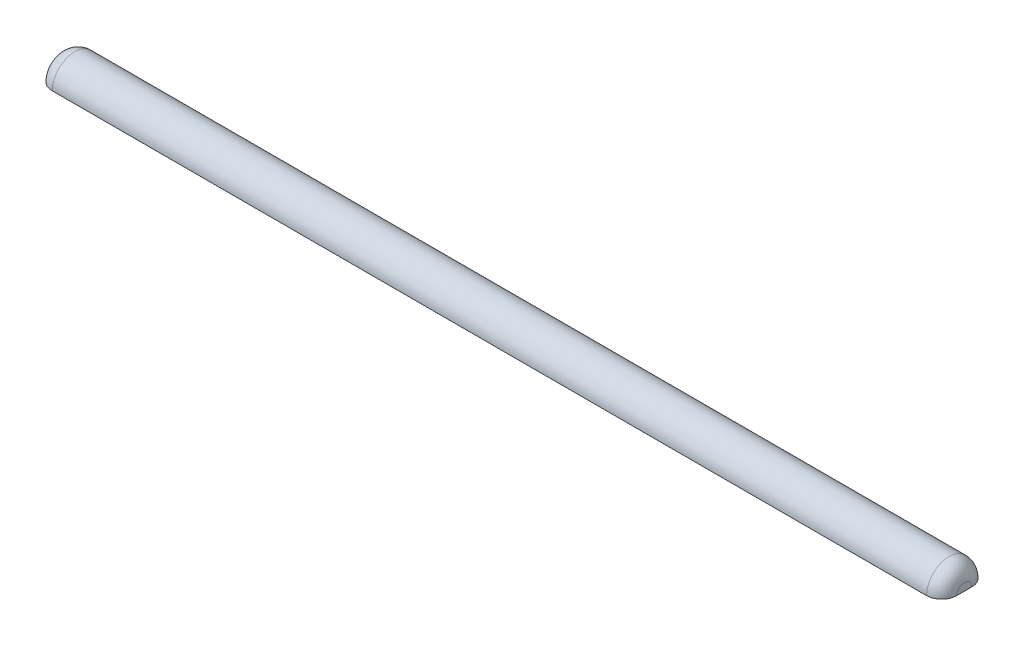
ISO-10303-21;
HEADER;
FILE_DESCRIPTION(('STEP AP214'),'2;1');
FILE_NAME('part.step','',(''),(''),'','','');
FILE_SCHEMA(('AUTOMOTIVE_DESIGN { 1 0 10303 214 1 1 1 1 }'));
ENDSEC;
DATA;
#1=APPLICATION_CONTEXT('core data for automotive mechanical design processes');
#2=APPLICATION_PROTOCOL_DEFINITION('international standard','automotive_design',2000,#1);
#3=PRODUCT_CONTEXT('',#1,'mechanical');
#4=PRODUCT('Part','Part','',(#3));
#5=PRODUCT_RELATED_PRODUCT_CATEGORY('part','',(#4));
#6=PRODUCT_DEFINITION_FORMATION('','',#4);
#7=PRODUCT_DEFINITION_CONTEXT('part definition',#1,'design');
#8=PRODUCT_DEFINITION('design','',#6,#7);
#9=PRODUCT_DEFINITION_SHAPE('','',#8);
#10=(LENGTH_UNIT() NAMED_UNIT(*) SI_UNIT(.MILLI.,.METRE.));
#11=(NAMED_UNIT(*) PLANE_ANGLE_UNIT() SI_UNIT($,.RADIAN.));
#12=(NAMED_UNIT(*) SI_UNIT($,.STERADIAN.) SOLID_ANGLE_UNIT());
#13=UNCERTAINTY_MEASURE_WITH_UNIT(LENGTH_MEASURE(1.E-05),#10,'distance_accuracy_value','');
#14=(GEOMETRIC_REPRESENTATION_CONTEXT(3) GLOBAL_UNCERTAINTY_ASSIGNED_CONTEXT((#13)) GLOBAL_UNIT_ASSIGNED_CONTEXT((#10,
#11,#12)) REPRESENTATION_CONTEXT('',''));
#15=CARTESIAN_POINT('',(0.,0.,0.));
#16=DIRECTION('',(0.,0.,1.));
#17=DIRECTION('',(1.,0.,0.));
#18=AXIS2_PLACEMENT_3D('',#15,#16,#17);
#19=CARTESIAN_POINT('',(3.,0.,-0.075));
#20=DIRECTION('',(-1.,0.,0.));
#21=DIRECTION('',(0.,0.,1.));
#22=AXIS2_PLACEMENT_3D('',#19,#20,#21);
#23=CYLINDRICAL_SURFACE('',#22,0.075);
#24=DIRECTION('',(-1.,0.,0.));
#25=VECTOR('',#24,1.);
#26=CARTESIAN_POINT('',(3.,0.,0.));
#27=LINE('',#26,#25);
#28=CARTESIAN_POINT('',(2.95,0.,0.));
#29=VERTEX_POINT('',#28);
#30=CARTESIAN_POINT('',(0.0500000000000001,0.,0.));
#31=VERTEX_POINT('',#30);
#32=EDGE_CURVE('E95',#29,#31,#27,.T.);
#33=ORIENTED_EDGE('',*,*,#32,.F.);
#34=CARTESIAN_POINT('',(2.95,0.,-0.075));
#35=DIRECTION('',(-1.,0.,0.));
#36=DIRECTION('',(0.,0.,1.));
#37=AXIS2_PLACEMENT_3D('',#34,#35,#36);
#38=CIRCLE('',#37,0.075);
#39=CARTESIAN_POINT('',(2.95,0.,-0.15));
#40=VERTEX_POINT('',#39);
#41=EDGE_CURVE('E47',#29,#40,#38,.T.);
#42=ORIENTED_EDGE('',*,*,#41,.T.);
#43=DIRECTION('',(-1.,0.,0.));
#44=VECTOR('',#43,1.);
#45=CARTESIAN_POINT('',(3.,0.,-0.15));
#46=LINE('',#45,#44);
#47=CARTESIAN_POINT('',(0.0500000000000001,0.,-0.15));
#48=VERTEX_POINT('',#47);
#49=EDGE_CURVE('E100',#40,#48,#46,.T.);
#50=ORIENTED_EDGE('',*,*,#49,.T.);
#51=CARTESIAN_POINT('',(0.0500000000000001,0.,-0.075));
#52=DIRECTION('',(-1.,0.,0.));
#53=DIRECTION('',(0.,0.,1.));
#54=AXIS2_PLACEMENT_3D('',#51,#52,#53);
#55=CIRCLE('',#54,0.075);
#56=EDGE_CURVE('E86',#48,#31,#55,.F.);
#57=ORIENTED_EDGE('',*,*,#56,.T.);
#58=EDGE_LOOP('',(#33,#42,#50,#57));
#59=FACE_BOUND('',#58,.T.);
#60=ADVANCED_FACE('F38',(#59),#23,.T.);
#61=CARTESIAN_POINT('',(3.,0.,0.));
#62=DIRECTION('',(0.,1.,0.));
#63=DIRECTION('',(0.,0.,1.));
#64=AXIS2_PLACEMENT_3D('',#61,#62,#63);
#65=PLANE('',#64);
#66=DIRECTION('',(0.,0.,-1.));
#67=VECTOR('',#66,1.);
#68=CARTESIAN_POINT('',(3.,0.,0.));
#69=LINE('',#68,#67);
#70=CARTESIAN_POINT('',(3.,0.,-0.05));
#71=VERTEX_POINT('',#70);
#72=CARTESIAN_POINT('',(3.,0.,-0.1));
#73=VERTEX_POINT('',#72);
#74=EDGE_CURVE('E92',#71,#73,#69,.T.);
#75=ORIENTED_EDGE('',*,*,#74,.F.);
#76=CARTESIAN_POINT('',(2.95,0.,-0.05));
#77=DIRECTION('',(0.,1.,0.));
#78=DIRECTION('',(0.,0.,1.));
#79=AXIS2_PLACEMENT_3D('',#76,#77,#78);
#80=CIRCLE('',#79,0.05);
#81=EDGE_CURVE('E62',#71,#29,#80,.F.);
#82=ORIENTED_EDGE('',*,*,#81,.T.);
#83=ORIENTED_EDGE('',*,*,#32,.T.);
#84=CARTESIAN_POINT('',(0.0500000000000001,0.,-0.05));
#85=DIRECTION('',(0.,1.,0.));
#86=DIRECTION('',(0.,0.,1.));
#87=AXIS2_PLACEMENT_3D('',#84,#85,#86);
#88=CIRCLE('',#87,0.05);
#89=CARTESIAN_POINT('',(0.,0.,-0.05));
#90=VERTEX_POINT('',#89);
#91=EDGE_CURVE('E54',#31,#90,#88,.F.);
#92=ORIENTED_EDGE('',*,*,#91,.T.);
#93=DIRECTION('',(0.,0.,-1.));
#94=VECTOR('',#93,1.);
#95=CARTESIAN_POINT('',(0.,0.,0.));
#96=LINE('',#95,#94);
#97=CARTESIAN_POINT('',(0.,0.,-0.1));
#98=VERTEX_POINT('',#97);
#99=EDGE_CURVE('E101',#90,#98,#96,.T.);
#100=ORIENTED_EDGE('',*,*,#99,.T.);
#101=CARTESIAN_POINT('',(0.0500000000000001,0.,-0.1));
#102=DIRECTION('',(0.,1.,0.));
#103=DIRECTION('',(0.,0.,1.));
#104=AXIS2_PLACEMENT_3D('',#101,#102,#103);
#105=CIRCLE('',#104,0.05);
#106=EDGE_CURVE('E94',#98,#48,#105,.F.);
#107=ORIENTED_EDGE('',*,*,#106,.T.);
#108=ORIENTED_EDGE('',*,*,#49,.F.);
#109=CARTESIAN_POINT('',(2.95,0.,-0.1));
#110=DIRECTION('',(0.,1.,0.));
#111=DIRECTION('',(0.,0.,1.));
#112=AXIS2_PLACEMENT_3D('',#109,#110,#111);
#113=CIRCLE('',#112,0.05);
#114=EDGE_CURVE('E87',#40,#73,#113,.F.);
#115=ORIENTED_EDGE('',*,*,#114,.T.);
#116=EDGE_LOOP('',(#75,#82,#83,#92,#100,#107,#108,#115));
#117=FACE_BOUND('',#116,.T.);
#118=ADVANCED_FACE('F97',(#117),#65,.F.);
#119=CARTESIAN_POINT('',(3.,0.,-0.075));
#120=DIRECTION('',(-1.,0.,0.));
#121=DIRECTION('',(0.,0.,1.));
#122=AXIS2_PLACEMENT_3D('',#119,#120,#121);
#123=PLANE('',#122);
#124=ORIENTED_EDGE('',*,*,#74,.T.);
#125=CARTESIAN_POINT('',(3.,0.,-0.075));
#126=DIRECTION('',(-1.,0.,0.));
#127=DIRECTION('',(0.,0.,1.));
#128=AXIS2_PLACEMENT_3D('',#125,#126,#127);
#129=CIRCLE('',#128,0.025);
#130=EDGE_CURVE('E84',#73,#71,#129,.F.);
#131=ORIENTED_EDGE('',*,*,#130,.T.);
#132=EDGE_LOOP('',(#124,#131));
#133=FACE_BOUND('',#132,.T.);
#134=ADVANCED_FACE('F91',(#133),#123,.F.);
#135=CARTESIAN_POINT('',(0.,0.,-0.075));
#136=DIRECTION('',(-1.,0.,0.));
#137=DIRECTION('',(0.,0.,1.));
#138=AXIS2_PLACEMENT_3D('',#135,#136,#137);
#139=PLANE('',#138);
#140=ORIENTED_EDGE('',*,*,#99,.F.);
#141=CARTESIAN_POINT('',(0.,0.,-0.075));
#142=DIRECTION('',(-1.,0.,0.));
#143=DIRECTION('',(0.,0.,1.));
#144=AXIS2_PLACEMENT_3D('',#141,#142,#143);
#145=CIRCLE('',#144,0.025);
#146=EDGE_CURVE('E11',#90,#98,#145,.T.);
#147=ORIENTED_EDGE('',*,*,#146,.T.);
#148=EDGE_LOOP('',(#140,#147));
#149=FACE_BOUND('',#148,.T.);
#150=ADVANCED_FACE('F124',(#149),#139,.T.);
#151=CARTESIAN_POINT('',(2.95,0.,-0.075));
#152=DIRECTION('',(-1.,0.,0.));
#153=DIRECTION('',(0.,0.,1.));
#154=AXIS2_PLACEMENT_3D('',#151,#152,#153);
#155=DEGENERATE_TOROIDAL_SURFACE('',#154,0.025,0.05,.T.);
#156=ORIENTED_EDGE('',*,*,#114,.F.);
#157=ORIENTED_EDGE('',*,*,#41,.F.);
#158=ORIENTED_EDGE('',*,*,#81,.F.);
#159=ORIENTED_EDGE('',*,*,#130,.F.);
#160=EDGE_LOOP('',(#156,#157,#158,#159));
#161=FACE_BOUND('',#160,.T.);
#162=ADVANCED_FACE('F83',(#161),#155,.T.);
#163=CARTESIAN_POINT('',(0.0500000000000001,0.,-0.075));
#164=DIRECTION('',(-1.,0.,0.));
#165=DIRECTION('',(0.,0.,1.));
#166=AXIS2_PLACEMENT_3D('',#163,#164,#165);
#167=DEGENERATE_TOROIDAL_SURFACE('',#166,0.025,0.05,.T.);
#168=ORIENTED_EDGE('',*,*,#106,.F.);
#169=ORIENTED_EDGE('',*,*,#146,.F.);
#170=ORIENTED_EDGE('',*,*,#91,.F.);
#171=ORIENTED_EDGE('',*,*,#56,.F.);
#172=EDGE_LOOP('',(#168,#169,#170,#171));
#173=FACE_BOUND('',#172,.T.);
#174=ADVANCED_FACE('F40',(#173),#167,.T.);
#175=CLOSED_SHELL('',(#60,#118,#134,#150,#162,#174));
#176=MANIFOLD_SOLID_BREP('B2',#175);
#177=ADVANCED_BREP_SHAPE_REPRESENTATION('',(#18,#176),#14);
#178=SHAPE_DEFINITION_REPRESENTATION(#9,#177);
ENDSEC;
END-ISO-10303-21;
